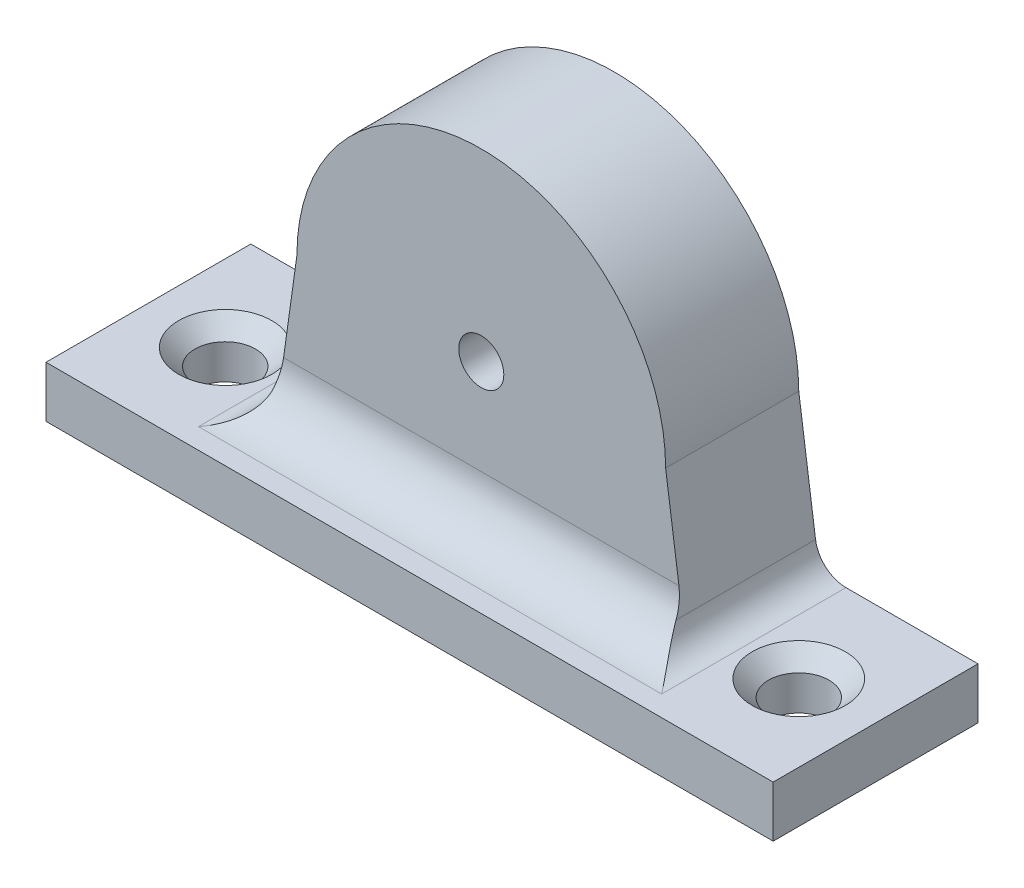
ISO-10303-21;
HEADER;
FILE_DESCRIPTION(('STEP AP214'),'2;1');
FILE_NAME('part.step','',(''),(''),'','','');
FILE_SCHEMA(('AUTOMOTIVE_DESIGN { 1 0 10303 214 1 1 1 1 }'));
ENDSEC;
DATA;
#1=APPLICATION_CONTEXT('core data for automotive mechanical design processes');
#2=APPLICATION_PROTOCOL_DEFINITION('international standard','automotive_design',2000,#1);
#3=PRODUCT_CONTEXT('',#1,'mechanical');
#4=PRODUCT('Part','Part','',(#3));
#5=PRODUCT_RELATED_PRODUCT_CATEGORY('part','',(#4));
#6=PRODUCT_DEFINITION_FORMATION('','',#4);
#7=PRODUCT_DEFINITION_CONTEXT('part definition',#1,'design');
#8=PRODUCT_DEFINITION('design','',#6,#7);
#9=PRODUCT_DEFINITION_SHAPE('','',#8);
#10=(LENGTH_UNIT() NAMED_UNIT(*) SI_UNIT(.MILLI.,.METRE.));
#11=(NAMED_UNIT(*) PLANE_ANGLE_UNIT() SI_UNIT($,.RADIAN.));
#12=(NAMED_UNIT(*) SI_UNIT($,.STERADIAN.) SOLID_ANGLE_UNIT());
#13=UNCERTAINTY_MEASURE_WITH_UNIT(LENGTH_MEASURE(1.E-05),#10,'distance_accuracy_value','');
#14=(GEOMETRIC_REPRESENTATION_CONTEXT(3) GLOBAL_UNCERTAINTY_ASSIGNED_CONTEXT((#13)) GLOBAL_UNIT_ASSIGNED_CONTEXT((#10,
#11,#12)) REPRESENTATION_CONTEXT('',''));
#15=CARTESIAN_POINT('',(0.,0.,0.));
#16=DIRECTION('',(0.,0.,1.));
#17=DIRECTION('',(1.,0.,0.));
#18=AXIS2_PLACEMENT_3D('',#15,#16,#17);
#19=CARTESIAN_POINT('',(18.,19.3,-10.));
#20=DIRECTION('',(-0.990360756265353,-0.138511993883266,0.));
#21=DIRECTION('',(0.,0.,-1.));
#22=AXIS2_PLACEMENT_3D('',#19,#20,#21);
#23=PLANE('',#22);
#24=DIRECTION('',(-0.138511993883266,0.990360756265353,0.));
#25=VECTOR('',#24,1.);
#26=CARTESIAN_POINT('',(17.3093193918174,24.2383663485059,3.));
#27=LINE('',#26,#25);
#28=CARTESIAN_POINT('',(18.,19.3,3.));
#29=VERTEX_POINT('',#28);
#30=CARTESIAN_POINT('',(19.3006993006993,10.,3.));
#31=VERTEX_POINT('',#30);
#32=EDGE_CURVE('E213',#29,#31,#27,.F.);
#33=ORIENTED_EDGE('',*,*,#32,.T.);
#34=CARTESIAN_POINT('',(19.3006993006993,10.,8.));
#35=DIRECTION('',(-0.990360756265353,-0.138511993883266,0.));
#36=DIRECTION('',(0.138511993883266,-0.990360756265353,0.));
#37=AXIS2_PLACEMENT_3D('',#34,#35,#36);
#38=ELLIPSE('',#37,5.04866531551087,5.);
#39=CARTESIAN_POINT('',(19.63853650093,7.5844640183502,3.62219393744365));
#40=VERTEX_POINT('',#39);
#41=EDGE_CURVE('E234',#31,#40,#38,.T.);
#42=ORIENTED_EDGE('',*,*,#41,.T.);
#43=DIRECTION('',(0.,0.,1.));
#44=VECTOR('',#43,1.);
#45=CARTESIAN_POINT('',(19.63853650093,7.5844640183502,-10.));
#46=LINE('',#45,#44);
#47=CARTESIAN_POINT('',(19.63853650093,7.5844640183502,-10.));
#48=VERTEX_POINT('',#47);
#49=EDGE_CURVE('E68',#40,#48,#46,.F.);
#50=ORIENTED_EDGE('',*,*,#49,.T.);
#51=DIRECTION('',(0.138511993883266,-0.990360756265353,0.));
#52=VECTOR('',#51,1.);
#53=CARTESIAN_POINT('',(18.,19.3,-10.));
#54=LINE('',#53,#52);
#55=CARTESIAN_POINT('',(18.,19.3,-10.));
#56=VERTEX_POINT('',#55);
#57=EDGE_CURVE('E216',#48,#56,#54,.F.);
#58=ORIENTED_EDGE('',*,*,#57,.T.);
#59=DIRECTION('',(0.,0.,-1.));
#60=VECTOR('',#59,1.);
#61=CARTESIAN_POINT('',(18.,19.3,-10.));
#62=LINE('',#61,#60);
#63=EDGE_CURVE('E147',#29,#56,#62,.T.);
#64=ORIENTED_EDGE('',*,*,#63,.F.);
#65=EDGE_LOOP('',(#33,#42,#50,#58,#64));
#66=FACE_BOUND('',#65,.T.);
#67=ADVANCED_FACE('F45',(#66),#23,.F.);
#68=CARTESIAN_POINT('',(-18.,19.3,-10.));
#69=DIRECTION('',(0.990360756265353,-0.138511993883266,0.));
#70=DIRECTION('',(0.,0.,1.));
#71=AXIS2_PLACEMENT_3D('',#68,#69,#70);
#72=PLANE('',#71);
#73=DIRECTION('',(0.138511993883266,0.990360756265353,0.));
#74=VECTOR('',#73,1.);
#75=CARTESIAN_POINT('',(-18.,19.3,-10.));
#76=LINE('',#75,#74);
#77=CARTESIAN_POINT('',(-18.,19.3,-10.));
#78=VERTEX_POINT('',#77);
#79=CARTESIAN_POINT('',(-19.63853650093,7.5844640183502,-10.));
#80=VERTEX_POINT('',#79);
#81=EDGE_CURVE('E129',#78,#80,#76,.F.);
#82=ORIENTED_EDGE('',*,*,#81,.T.);
#83=DIRECTION('',(0.,0.,-1.));
#84=VECTOR('',#83,1.);
#85=CARTESIAN_POINT('',(-19.63853650093,7.5844640183502,-10.));
#86=LINE('',#85,#84);
#87=CARTESIAN_POINT('',(-19.63853650093,7.5844640183502,3.62219393744365));
#88=VERTEX_POINT('',#87);
#89=EDGE_CURVE('E60',#80,#88,#86,.F.);
#90=ORIENTED_EDGE('',*,*,#89,.T.);
#91=CARTESIAN_POINT('',(-19.3006993006993,10.,8.));
#92=DIRECTION('',(0.990360756265353,-0.138511993883266,0.));
#93=DIRECTION('',(0.138511993883266,0.990360756265353,0.));
#94=AXIS2_PLACEMENT_3D('',#91,#92,#93);
#95=ELLIPSE('',#94,5.04866531551087,5.);
#96=CARTESIAN_POINT('',(-19.3006993006993,10.,3.));
#97=VERTEX_POINT('',#96);
#98=EDGE_CURVE('E13',#88,#97,#95,.T.);
#99=ORIENTED_EDGE('',*,*,#98,.T.);
#100=DIRECTION('',(-0.138511993883266,-0.990360756265353,0.));
#101=VECTOR('',#100,1.);
#102=CARTESIAN_POINT('',(-18.,19.3,3.));
#103=LINE('',#102,#101);
#104=CARTESIAN_POINT('',(-18.,19.3,3.));
#105=VERTEX_POINT('',#104);
#106=EDGE_CURVE('E137',#97,#105,#103,.F.);
#107=ORIENTED_EDGE('',*,*,#106,.T.);
#108=DIRECTION('',(0.,0.,1.));
#109=VECTOR('',#108,1.);
#110=CARTESIAN_POINT('',(-18.,19.3,-10.));
#111=LINE('',#110,#109);
#112=EDGE_CURVE('E141',#78,#105,#111,.T.);
#113=ORIENTED_EDGE('',*,*,#112,.F.);
#114=EDGE_LOOP('',(#82,#90,#99,#107,#113));
#115=FACE_BOUND('',#114,.T.);
#116=ADVANCED_FACE('F142',(#115),#72,.F.);
#117=CARTESIAN_POINT('',(-35.5,5.,10.));
#118=DIRECTION('',(0.,0.,-1.));
#119=DIRECTION('',(-1.,0.,0.));
#120=AXIS2_PLACEMENT_3D('',#117,#118,#119);
#121=PLANE('',#120);
#122=DIRECTION('',(1.,0.,0.));
#123=VECTOR('',#122,1.);
#124=CARTESIAN_POINT('',(-35.5,0.,10.));
#125=LINE('',#124,#123);
#126=CARTESIAN_POINT('',(-35.5,0.,10.));
#127=VERTEX_POINT('',#126);
#128=CARTESIAN_POINT('',(35.5,0.,10.));
#129=VERTEX_POINT('',#128);
#130=EDGE_CURVE('E166',#127,#129,#125,.T.);
#131=ORIENTED_EDGE('',*,*,#130,.T.);
#132=DIRECTION('',(0.,-1.,0.));
#133=VECTOR('',#132,1.);
#134=CARTESIAN_POINT('',(35.5,5.,10.));
#135=LINE('',#134,#133);
#136=CARTESIAN_POINT('',(35.5,5.,10.));
#137=VERTEX_POINT('',#136);
#138=EDGE_CURVE('E198',#137,#129,#135,.T.);
#139=ORIENTED_EDGE('',*,*,#138,.F.);
#140=DIRECTION('',(1.,0.,0.));
#141=VECTOR('',#140,1.);
#142=CARTESIAN_POINT('',(-35.5,5.,10.));
#143=LINE('',#142,#141);
#144=CARTESIAN_POINT('',(-35.5,5.,10.));
#145=VERTEX_POINT('',#144);
#146=EDGE_CURVE('E169',#145,#137,#143,.T.);
#147=ORIENTED_EDGE('',*,*,#146,.F.);
#148=DIRECTION('',(0.,-1.,0.));
#149=VECTOR('',#148,1.);
#150=CARTESIAN_POINT('',(-35.5,5.,10.));
#151=LINE('',#150,#149);
#152=EDGE_CURVE('E182',#145,#127,#151,.T.);
#153=ORIENTED_EDGE('',*,*,#152,.T.);
#154=EDGE_LOOP('',(#131,#139,#147,#153));
#155=FACE_BOUND('',#154,.T.);
#156=ADVANCED_FACE('F267',(#155),#121,.F.);
#157=CARTESIAN_POINT('',(35.5,5.,10.));
#158=DIRECTION('',(-1.,0.,0.));
#159=DIRECTION('',(0.,0.,1.));
#160=AXIS2_PLACEMENT_3D('',#157,#158,#159);
#161=PLANE('',#160);
#162=DIRECTION('',(0.,0.,-1.));
#163=VECTOR('',#162,1.);
#164=CARTESIAN_POINT('',(35.5,0.,10.));
#165=LINE('',#164,#163);
#166=CARTESIAN_POINT('',(35.5,0.,-10.));
#167=VERTEX_POINT('',#166);
#168=EDGE_CURVE('E185',#129,#167,#165,.T.);
#169=ORIENTED_EDGE('',*,*,#168,.T.);
#170=DIRECTION('',(0.,-1.,0.));
#171=VECTOR('',#170,1.);
#172=CARTESIAN_POINT('',(35.5,5.,-10.));
#173=LINE('',#172,#171);
#174=CARTESIAN_POINT('',(35.5,5.,-10.));
#175=VERTEX_POINT('',#174);
#176=EDGE_CURVE('E196',#175,#167,#173,.T.);
#177=ORIENTED_EDGE('',*,*,#176,.F.);
#178=DIRECTION('',(0.,0.,-1.));
#179=VECTOR('',#178,1.);
#180=CARTESIAN_POINT('',(35.5,5.,10.));
#181=LINE('',#180,#179);
#182=EDGE_CURVE('E172',#137,#175,#181,.T.);
#183=ORIENTED_EDGE('',*,*,#182,.F.);
#184=ORIENTED_EDGE('',*,*,#138,.T.);
#185=EDGE_LOOP('',(#169,#177,#183,#184));
#186=FACE_BOUND('',#185,.T.);
#187=ADVANCED_FACE('F283',(#186),#161,.F.);
#188=CARTESIAN_POINT('',(-35.5,5.,-10.));
#189=DIRECTION('',(0.,0.,-1.));
#190=DIRECTION('',(-1.,0.,0.));
#191=AXIS2_PLACEMENT_3D('',#188,#189,#190);
#192=PLANE('',#191);
#193=ORIENTED_EDGE('',*,*,#57,.F.);
#194=CARTESIAN_POINT('',(22.6096187697261,8.,-10.));
#195=DIRECTION('',(0.,0.,-1.));
#196=DIRECTION('',(-1.,0.,0.));
#197=AXIS2_PLACEMENT_3D('',#194,#195,#196);
#198=CIRCLE('',#197,3.);
#199=CARTESIAN_POINT('',(22.6096187697261,5.,-10.));
#200=VERTEX_POINT('',#199);
#201=EDGE_CURVE('E225',#48,#200,#198,.F.);
#202=ORIENTED_EDGE('',*,*,#201,.T.);
#203=DIRECTION('',(1.,0.,0.));
#204=VECTOR('',#203,1.);
#205=CARTESIAN_POINT('',(-35.5,5.,-10.));
#206=LINE('',#205,#204);
#207=EDGE_CURVE('E176',#200,#175,#206,.T.);
#208=ORIENTED_EDGE('',*,*,#207,.T.);
#209=ORIENTED_EDGE('',*,*,#176,.T.);
#210=DIRECTION('',(1.,0.,0.));
#211=VECTOR('',#210,1.);
#212=CARTESIAN_POINT('',(-35.5,0.,-10.));
#213=LINE('',#212,#211);
#214=CARTESIAN_POINT('',(-35.5,0.,-10.));
#215=VERTEX_POINT('',#214);
#216=EDGE_CURVE('E188',#215,#167,#213,.T.);
#217=ORIENTED_EDGE('',*,*,#216,.F.);
#218=DIRECTION('',(0.,-1.,0.));
#219=VECTOR('',#218,1.);
#220=CARTESIAN_POINT('',(-35.5,5.,-10.));
#221=LINE('',#220,#219);
#222=CARTESIAN_POINT('',(-35.5,5.,-10.));
#223=VERTEX_POINT('',#222);
#224=EDGE_CURVE('E194',#223,#215,#221,.T.);
#225=ORIENTED_EDGE('',*,*,#224,.F.);
#226=CARTESIAN_POINT('',(-22.6096187697261,5.,-10.));
#227=VERTEX_POINT('',#226);
#228=EDGE_CURVE('E177',#223,#227,#206,.T.);
#229=ORIENTED_EDGE('',*,*,#228,.T.);
#230=CARTESIAN_POINT('',(-22.6096187697261,8.,-10.));
#231=DIRECTION('',(0.,0.,-1.));
#232=DIRECTION('',(-1.,0.,0.));
#233=AXIS2_PLACEMENT_3D('',#230,#231,#232);
#234=CIRCLE('',#233,3.);
#235=EDGE_CURVE('E136',#227,#80,#234,.F.);
#236=ORIENTED_EDGE('',*,*,#235,.T.);
#237=ORIENTED_EDGE('',*,*,#81,.F.);
#238=CARTESIAN_POINT('',(0.,19.3,-10.));
#239=DIRECTION('',(0.,0.,-1.));
#240=DIRECTION('',(1.,0.,0.));
#241=AXIS2_PLACEMENT_3D('',#238,#239,#240);
#242=CIRCLE('',#241,18.);
#243=EDGE_CURVE('E134',#78,#56,#242,.T.);
#244=ORIENTED_EDGE('',*,*,#243,.T.);
#245=EDGE_LOOP('',(#193,#202,#208,#209,#217,#225,#229,#236,#237,#244));
#246=FACE_BOUND('',#245,.T.);
#247=ADVANCED_FACE('F132',(#246),#192,.T.);
#248=CARTESIAN_POINT('',(-35.5,5.,10.));
#249=DIRECTION('',(-1.,0.,0.));
#250=DIRECTION('',(0.,0.,1.));
#251=AXIS2_PLACEMENT_3D('',#248,#249,#250);
#252=PLANE('',#251);
#253=DIRECTION('',(0.,0.,-1.));
#254=VECTOR('',#253,1.);
#255=CARTESIAN_POINT('',(-35.5,0.,10.));
#256=LINE('',#255,#254);
#257=EDGE_CURVE('E173',#127,#215,#256,.T.);
#258=ORIENTED_EDGE('',*,*,#257,.F.);
#259=ORIENTED_EDGE('',*,*,#152,.F.);
#260=DIRECTION('',(0.,0.,-1.));
#261=VECTOR('',#260,1.);
#262=CARTESIAN_POINT('',(-35.5,5.,10.));
#263=LINE('',#262,#261);
#264=EDGE_CURVE('E179',#145,#223,#263,.T.);
#265=ORIENTED_EDGE('',*,*,#264,.T.);
#266=ORIENTED_EDGE('',*,*,#224,.T.);
#267=EDGE_LOOP('',(#258,#259,#265,#266));
#268=FACE_BOUND('',#267,.T.);
#269=ADVANCED_FACE('F290',(#268),#252,.T.);
#270=CARTESIAN_POINT('',(0.,5.,0.));
#271=DIRECTION('',(0.,1.,0.));
#272=DIRECTION('',(0.,0.,1.));
#273=AXIS2_PLACEMENT_3D('',#270,#271,#272);
#274=PLANE('',#273);
#275=DIRECTION('',(0.,0.,1.));
#276=VECTOR('',#275,1.);
#277=CARTESIAN_POINT('',(22.6096187697261,5.,0.));
#278=LINE('',#277,#276);
#279=CARTESIAN_POINT('',(22.6096187697261,5.,8.));
#280=VERTEX_POINT('',#279);
#281=EDGE_CURVE('E221',#200,#280,#278,.T.);
#282=ORIENTED_EDGE('',*,*,#281,.T.);
#283=DIRECTION('',(1.,0.,0.));
#284=VECTOR('',#283,1.);
#285=CARTESIAN_POINT('',(0.,5.,8.));
#286=LINE('',#285,#284);
#287=CARTESIAN_POINT('',(-22.6096187697261,5.,8.));
#288=VERTEX_POINT('',#287);
#289=EDGE_CURVE('E231',#280,#288,#286,.F.);
#290=ORIENTED_EDGE('',*,*,#289,.T.);
#291=DIRECTION('',(0.,0.,-1.));
#292=VECTOR('',#291,1.);
#293=CARTESIAN_POINT('',(-22.6096187697261,5.,0.));
#294=LINE('',#293,#292);
#295=EDGE_CURVE('E218',#288,#227,#294,.T.);
#296=ORIENTED_EDGE('',*,*,#295,.T.);
#297=ORIENTED_EDGE('',*,*,#228,.F.);
#298=ORIENTED_EDGE('',*,*,#264,.F.);
#299=ORIENTED_EDGE('',*,*,#146,.T.);
#300=ORIENTED_EDGE('',*,*,#182,.T.);
#301=ORIENTED_EDGE('',*,*,#207,.F.);
#302=EDGE_LOOP('',(#282,#290,#296,#297,#298,#299,#300,#301));
#303=FACE_BOUND('',#302,.T.);
#304=CARTESIAN_POINT('',(28.,5.,0.));
#305=DIRECTION('',(0.,1.,0.));
#306=DIRECTION('',(0.,0.,1.));
#307=AXIS2_PLACEMENT_3D('',#304,#305,#306);
#308=CIRCLE('',#307,4.55000000000001);
#309=CARTESIAN_POINT('',(28.,5.,4.55000000000001));
#310=VERTEX_POINT('',#309);
#311=EDGE_CURVE('E207',#310,#310,#308,.F.);
#312=ORIENTED_EDGE('',*,*,#311,.T.);
#313=EDGE_LOOP('',(#312));
#314=FACE_BOUND('',#313,.T.);
#315=CARTESIAN_POINT('',(-28.,5.,0.));
#316=DIRECTION('',(0.,1.,0.));
#317=DIRECTION('',(0.,0.,1.));
#318=AXIS2_PLACEMENT_3D('',#315,#316,#317);
#319=CIRCLE('',#318,4.54999999999998);
#320=CARTESIAN_POINT('',(-28.,5.,4.54999999999998));
#321=VERTEX_POINT('',#320);
#322=EDGE_CURVE('E204',#321,#321,#319,.F.);
#323=ORIENTED_EDGE('',*,*,#322,.T.);
#324=EDGE_LOOP('',(#323));
#325=FACE_BOUND('',#324,.T.);
#326=ADVANCED_FACE('F278',(#303,#314,#325),#274,.T.);
#327=CARTESIAN_POINT('',(0.,0.,0.));
#328=DIRECTION('',(0.,1.,0.));
#329=DIRECTION('',(0.,0.,1.));
#330=AXIS2_PLACEMENT_3D('',#327,#328,#329);
#331=PLANE('',#330);
#332=CARTESIAN_POINT('',(28.,0.,0.));
#333=DIRECTION('',(0.,1.,0.));
#334=DIRECTION('',(0.,0.,1.));
#335=AXIS2_PLACEMENT_3D('',#332,#333,#334);
#336=CIRCLE('',#335,2.95);
#337=CARTESIAN_POINT('',(28.,0.,2.95));
#338=VERTEX_POINT('',#337);
#339=EDGE_CURVE('E163',#338,#338,#336,.T.);
#340=ORIENTED_EDGE('',*,*,#339,.T.);
#341=EDGE_LOOP('',(#340));
#342=FACE_BOUND('',#341,.T.);
#343=CARTESIAN_POINT('',(-28.,0.,0.));
#344=DIRECTION('',(0.,1.,0.));
#345=DIRECTION('',(0.,0.,1.));
#346=AXIS2_PLACEMENT_3D('',#343,#344,#345);
#347=CIRCLE('',#346,2.95);
#348=CARTESIAN_POINT('',(-28.,0.,2.95));
#349=VERTEX_POINT('',#348);
#350=EDGE_CURVE('E162',#349,#349,#347,.T.);
#351=ORIENTED_EDGE('',*,*,#350,.T.);
#352=EDGE_LOOP('',(#351));
#353=FACE_BOUND('',#352,.T.);
#354=ORIENTED_EDGE('',*,*,#130,.F.);
#355=ORIENTED_EDGE('',*,*,#257,.T.);
#356=ORIENTED_EDGE('',*,*,#216,.T.);
#357=ORIENTED_EDGE('',*,*,#168,.F.);
#358=EDGE_LOOP('',(#354,#355,#356,#357));
#359=FACE_BOUND('',#358,.T.);
#360=ADVANCED_FACE('F287',(#342,#353,#359),#331,.F.);
#361=CARTESIAN_POINT('',(-28.,0.,0.));
#362=DIRECTION('',(0.,1.,0.));
#363=DIRECTION('',(0.,0.,1.));
#364=AXIS2_PLACEMENT_3D('',#361,#362,#363);
#365=CYLINDRICAL_SURFACE('',#364,2.95);
#366=CARTESIAN_POINT('',(-28.,3.40000000000002,0.));
#367=DIRECTION('',(0.,1.,0.));
#368=DIRECTION('',(0.,0.,1.));
#369=AXIS2_PLACEMENT_3D('',#366,#367,#368);
#370=CIRCLE('',#369,2.95);
#371=CARTESIAN_POINT('',(-28.,3.40000000000002,2.95));
#372=VERTEX_POINT('',#371);
#373=EDGE_CURVE('E138',#372,#372,#370,.T.);
#374=ORIENTED_EDGE('',*,*,#373,.T.);
#375=EDGE_LOOP('',(#374));
#376=FACE_BOUND('',#375,.T.);
#377=ORIENTED_EDGE('',*,*,#350,.F.);
#378=EDGE_LOOP('',(#377));
#379=FACE_BOUND('',#378,.T.);
#380=ADVANCED_FACE('F331',(#376,#379),#365,.F.);
#381=CARTESIAN_POINT('',(28.,0.,0.));
#382=DIRECTION('',(0.,1.,0.));
#383=DIRECTION('',(0.,0.,1.));
#384=AXIS2_PLACEMENT_3D('',#381,#382,#383);
#385=CYLINDRICAL_SURFACE('',#384,2.95);
#386=CARTESIAN_POINT('',(28.,3.4,0.));
#387=DIRECTION('',(0.,1.,0.));
#388=DIRECTION('',(0.,0.,1.));
#389=AXIS2_PLACEMENT_3D('',#386,#387,#388);
#390=CIRCLE('',#389,2.95);
#391=CARTESIAN_POINT('',(28.,3.4,2.95));
#392=VERTEX_POINT('',#391);
#393=EDGE_CURVE('E201',#392,#392,#390,.T.);
#394=ORIENTED_EDGE('',*,*,#393,.T.);
#395=EDGE_LOOP('',(#394));
#396=FACE_BOUND('',#395,.T.);
#397=ORIENTED_EDGE('',*,*,#339,.F.);
#398=EDGE_LOOP('',(#397));
#399=FACE_BOUND('',#398,.T.);
#400=ADVANCED_FACE('F311',(#396,#399),#385,.F.);
#401=CARTESIAN_POINT('',(28.,3.4,0.));
#402=DIRECTION('',(0.,1.,0.));
#403=DIRECTION('',(0.,0.,1.));
#404=AXIS2_PLACEMENT_3D('',#401,#402,#403);
#405=CONICAL_SURFACE('',#404,2.95,0.78539816339745);
#406=ORIENTED_EDGE('',*,*,#311,.F.);
#407=EDGE_LOOP('',(#406));
#408=FACE_BOUND('',#407,.T.);
#409=ORIENTED_EDGE('',*,*,#393,.F.);
#410=EDGE_LOOP('',(#409));
#411=FACE_BOUND('',#410,.T.);
#412=ADVANCED_FACE('F304',(#408,#411),#405,.F.);
#413=CARTESIAN_POINT('',(-28.,3.40000000000002,0.));
#414=DIRECTION('',(0.,1.,0.));
#415=DIRECTION('',(0.,0.,1.));
#416=AXIS2_PLACEMENT_3D('',#413,#414,#415);
#417=CONICAL_SURFACE('',#416,2.95,0.78539816339745);
#418=ORIENTED_EDGE('',*,*,#322,.F.);
#419=EDGE_LOOP('',(#418));
#420=FACE_BOUND('',#419,.T.);
#421=ORIENTED_EDGE('',*,*,#373,.F.);
#422=EDGE_LOOP('',(#421));
#423=FACE_BOUND('',#422,.T.);
#424=ADVANCED_FACE('F310',(#420,#423),#417,.F.);
#425=CARTESIAN_POINT('',(-18.,19.3,3.));
#426=DIRECTION('',(0.,0.,-1.));
#427=DIRECTION('',(-1.,0.,0.));
#428=AXIS2_PLACEMENT_3D('',#425,#426,#427);
#429=PLANE('',#428);
#430=CARTESIAN_POINT('',(0.,19.3,3.));
#431=DIRECTION('',(0.,0.,1.));
#432=DIRECTION('',(1.,0.,0.));
#433=AXIS2_PLACEMENT_3D('',#430,#431,#432);
#434=CIRCLE('',#433,2.2);
#435=CARTESIAN_POINT('',(2.2,19.3,3.));
#436=VERTEX_POINT('',#435);
#437=EDGE_CURVE('E157',#436,#436,#434,.T.);
#438=ORIENTED_EDGE('',*,*,#437,.F.);
#439=EDGE_LOOP('',(#438));
#440=FACE_BOUND('',#439,.T.);
#441=ORIENTED_EDGE('',*,*,#106,.F.);
#442=DIRECTION('',(1.,0.,0.));
#443=VECTOR('',#442,1.);
#444=CARTESIAN_POINT('',(-18.,10.,3.));
#445=LINE('',#444,#443);
#446=EDGE_CURVE('E228',#97,#31,#445,.T.);
#447=ORIENTED_EDGE('',*,*,#446,.T.);
#448=ORIENTED_EDGE('',*,*,#32,.F.);
#449=CARTESIAN_POINT('',(0.,19.3,3.));
#450=DIRECTION('',(0.,0.,-1.));
#451=DIRECTION('',(1.,0.,0.));
#452=AXIS2_PLACEMENT_3D('',#449,#450,#451);
#453=CIRCLE('',#452,18.);
#454=EDGE_CURVE('E148',#105,#29,#453,.T.);
#455=ORIENTED_EDGE('',*,*,#454,.F.);
#456=EDGE_LOOP('',(#441,#447,#448,#455));
#457=FACE_BOUND('',#456,.T.);
#458=ADVANCED_FACE('F270',(#440,#457),#429,.F.);
#459=CARTESIAN_POINT('',(0.,19.3,3.));
#460=DIRECTION('',(0.,0.,-1.));
#461=DIRECTION('',(-1.,0.,0.));
#462=AXIS2_PLACEMENT_3D('',#459,#460,#461);
#463=CYLINDRICAL_SURFACE('',#462,18.);
#464=ORIENTED_EDGE('',*,*,#243,.F.);
#465=ORIENTED_EDGE('',*,*,#112,.T.);
#466=ORIENTED_EDGE('',*,*,#454,.T.);
#467=ORIENTED_EDGE('',*,*,#63,.T.);
#468=EDGE_LOOP('',(#464,#465,#466,#467));
#469=FACE_BOUND('',#468,.T.);
#470=ADVANCED_FACE('F151',(#469),#463,.T.);
#471=CARTESIAN_POINT('',(0.,19.3,-9.));
#472=DIRECTION('',(0.,0.,1.));
#473=DIRECTION('',(1.,0.,0.));
#474=AXIS2_PLACEMENT_3D('',#471,#472,#473);
#475=CYLINDRICAL_SURFACE('',#474,2.2);
#476=CARTESIAN_POINT('',(0.,19.3,-9.));
#477=DIRECTION('',(0.,0.,1.));
#478=DIRECTION('',(1.,0.,0.));
#479=AXIS2_PLACEMENT_3D('',#476,#477,#478);
#480=CIRCLE('',#479,2.2);
#481=CARTESIAN_POINT('',(2.2,19.3,-9.));
#482=VERTEX_POINT('',#481);
#483=EDGE_CURVE('E153',#482,#482,#480,.T.);
#484=ORIENTED_EDGE('',*,*,#483,.F.);
#485=EDGE_LOOP('',(#484));
#486=FACE_BOUND('',#485,.T.);
#487=ORIENTED_EDGE('',*,*,#437,.T.);
#488=EDGE_LOOP('',(#487));
#489=FACE_BOUND('',#488,.T.);
#490=ADVANCED_FACE('F358',(#486,#489),#475,.F.);
#491=CARTESIAN_POINT('',(0.,19.3,-9.));
#492=DIRECTION('',(0.,0.,1.));
#493=DIRECTION('',(1.,0.,0.));
#494=AXIS2_PLACEMENT_3D('',#491,#492,#493);
#495=PLANE('',#494);
#496=ORIENTED_EDGE('',*,*,#483,.T.);
#497=EDGE_LOOP('',(#496));
#498=FACE_BOUND('',#497,.T.);
#499=ADVANCED_FACE('F251',(#498),#495,.T.);
#500=CARTESIAN_POINT('',(22.6096187697261,8.,0.));
#501=DIRECTION('',(0.,0.,1.));
#502=DIRECTION('',(1.,0.,0.));
#503=AXIS2_PLACEMENT_3D('',#500,#501,#502);
#504=CYLINDRICAL_SURFACE('',#503,3.);
#505=ORIENTED_EDGE('',*,*,#201,.F.);
#506=ORIENTED_EDGE('',*,*,#49,.F.);
#507=CARTESIAN_POINT('',(19.63853650093,7.5844640183502,3.62219393744365));
#508=CARTESIAN_POINT('',(19.6516758111666,7.49051498650996,3.67401136505807));
#509=CARTESIAN_POINT('',(19.6690473429782,7.39878081510673,3.72859107094716));
#510=CARTESIAN_POINT('',(19.711252884602,7.22034586825496,3.84251798344618));
#511=CARTESIAN_POINT('',(19.7360731557372,7.1336361738169,3.90185626679708));
#512=CARTESIAN_POINT('',(19.7919418379846,6.9663673355544,4.02410867171887));
#513=CARTESIAN_POINT('',(19.8229238450006,6.88575428580177,4.0869799366073));
#514=CARTESIAN_POINT('',(19.8904405556834,6.72984621249943,4.21630368523532));
#515=CARTESIAN_POINT('',(19.9269785566882,6.65455438608417,4.28275828037221));
#516=CARTESIAN_POINT('',(20.0171680279644,6.48640793712458,4.44025112263436));
#517=CARTESIAN_POINT('',(20.0725751168669,6.3955403454138,4.53241115356753));
#518=CARTESIAN_POINT('',(20.1901621834393,6.223172121695,4.72099012099338));
#519=CARTESIAN_POINT('',(20.2523432990811,6.14167306825301,4.8174097714393));
#520=CARTESIAN_POINT('',(20.4478709102071,5.91006138482799,5.11291720067182));
#521=CARTESIAN_POINT('',(20.5896895447706,5.77374025684661,5.31738619517603));
#522=CARTESIAN_POINT('',(20.8415324679503,5.57282717795078,5.67026651586142));
#523=CARTESIAN_POINT('',(20.9477827125631,5.49909998905815,5.81640433344452));
#524=CARTESIAN_POINT('',(21.1655491783222,5.36734859940914,6.11195734801102));
#525=CARTESIAN_POINT('',(21.2770677253793,5.30933141203368,6.26137397667506));
#526=CARTESIAN_POINT('',(21.5036073240907,5.20856926285163,6.56218266234524));
#527=CARTESIAN_POINT('',(21.6186219233378,5.16579782395809,6.71357081663567));
#528=CARTESIAN_POINT('',(21.8510885285004,5.09493785236139,7.01778852308041));
#529=CARTESIAN_POINT('',(21.9685393499369,5.06684235055439,7.17061735594026));
#530=CARTESIAN_POINT('',(22.1719439122111,5.03083564064062,7.43443725244717));
#531=CARTESIAN_POINT('',(22.2575649582214,5.01948294231306,7.54523291775342));
#532=CARTESIAN_POINT('',(22.4291141765131,5.00419866303723,7.76696529176576));
#533=CARTESIAN_POINT('',(22.5150420081173,5.00026049410995,7.8779017875394));
#534=CARTESIAN_POINT('',(22.6038452838565,5.00000416750099,7.99254646170429));
#535=CARTESIAN_POINT('',(22.6067320370262,5.00000000095933,7.99627324398704));
#536=CARTESIAN_POINT('',(22.6096187697261,5.,8.));
#537=B_SPLINE_CURVE_WITH_KNOTS('',3,(#507,#508,#509,#510,#511,#512,#513,#514,#515,#516,#517,
#518,#519,#520,#521,#522,#523,#524,#525,#526,#527,#528,#529,#530,#531,#532,#533,#534,#535,#536),
.UNSPECIFIED.,.F.,.F.,(4,2,2,2,2,2,2,2,2,2,2,2,2,2,4),(0.,0.324014065951598,0.647434145733564,
0.967541186908921,1.28783895014233,1.70954823647149,2.13132847551312,2.97890473267685,
3.56370939361495,4.14877469877583,4.73281892066649,5.31658554709527,5.737861291013,
6.1587625448185,6.17290468596665),.UNSPECIFIED.);
#538=EDGE_CURVE('E236',#40,#280,#537,.T.);
#539=ORIENTED_EDGE('',*,*,#538,.T.);
#540=ORIENTED_EDGE('',*,*,#281,.F.);
#541=EDGE_LOOP('',(#505,#506,#539,#540));
#542=FACE_BOUND('',#541,.T.);
#543=ADVANCED_FACE('F246',(#542),#504,.F.);
#544=CARTESIAN_POINT('',(-22.6096187697261,8.,0.));
#545=DIRECTION('',(0.,0.,-1.));
#546=DIRECTION('',(-1.,0.,0.));
#547=AXIS2_PLACEMENT_3D('',#544,#545,#546);
#548=CYLINDRICAL_SURFACE('',#547,3.);
#549=ORIENTED_EDGE('',*,*,#295,.F.);
#550=CARTESIAN_POINT('',(-19.63853650093,7.5844640183502,3.62219393744365));
#551=CARTESIAN_POINT('',(-19.6516758111666,7.49051498650996,3.67401136505807));
#552=CARTESIAN_POINT('',(-19.6690473429782,7.39878081510673,3.72859107094716));
#553=CARTESIAN_POINT('',(-19.711252884602,7.22034586825496,3.84251798344618));
#554=CARTESIAN_POINT('',(-19.7360731557372,7.1336361738169,3.90185626679708));
#555=CARTESIAN_POINT('',(-19.7919418379846,6.9663673355544,4.02410867171887));
#556=CARTESIAN_POINT('',(-19.8229238450006,6.88575428580178,4.0869799366073));
#557=CARTESIAN_POINT('',(-19.8904405556834,6.72984621249944,4.21630368523531));
#558=CARTESIAN_POINT('',(-19.9269785566882,6.65455438608417,4.2827582803722));
#559=CARTESIAN_POINT('',(-20.0171680279644,6.48640793712458,4.44025112263436));
#560=CARTESIAN_POINT('',(-20.0725751168669,6.39554034541381,4.53241115356753));
#561=CARTESIAN_POINT('',(-20.1901621834393,6.223172121695,4.72099012099338));
#562=CARTESIAN_POINT('',(-20.2523432990811,6.14167306825301,4.8174097714393));
#563=CARTESIAN_POINT('',(-20.4478709102071,5.91006138482799,5.11291720067181));
#564=CARTESIAN_POINT('',(-20.5896895447706,5.77374025684662,5.31738619517603));
#565=CARTESIAN_POINT('',(-20.8415324679503,5.57282717795078,5.67026651586141));
#566=CARTESIAN_POINT('',(-20.9477827125631,5.49909998905816,5.81640433344452));
#567=CARTESIAN_POINT('',(-21.1655491783222,5.36734859940914,6.11195734801102));
#568=CARTESIAN_POINT('',(-21.2770677253793,5.30933141203368,6.26137397667505));
#569=CARTESIAN_POINT('',(-21.5036073240907,5.20856926285163,6.56218266234524));
#570=CARTESIAN_POINT('',(-21.6186219233378,5.16579782395809,6.71357081663567));
#571=CARTESIAN_POINT('',(-21.8510885285004,5.09493785236139,7.01778852308041));
#572=CARTESIAN_POINT('',(-21.9685393499369,5.06684235055439,7.17061735594024));
#573=CARTESIAN_POINT('',(-22.1719439122111,5.03083564064062,7.43443725244719));
#574=CARTESIAN_POINT('',(-22.2575649582214,5.01948294231306,7.54523291775346));
#575=CARTESIAN_POINT('',(-22.4291141765131,5.00419866303723,7.76696529176571));
#576=CARTESIAN_POINT('',(-22.5150420081175,5.00026049410995,7.87790178753924));
#577=CARTESIAN_POINT('',(-22.6038452838565,5.00000416750099,7.99254646170428));
#578=CARTESIAN_POINT('',(-22.6067320370262,5.00000000095933,7.99627324398704));
#579=CARTESIAN_POINT('',(-22.6096187697261,5.,8.));
#580=B_SPLINE_CURVE_WITH_KNOTS('',3,(#550,#551,#552,#553,#554,#555,#556,#557,#558,#559,#560,
#561,#562,#563,#564,#565,#566,#567,#568,#569,#570,#571,#572,#573,#574,#575,#576,#577,#578,#579),
.UNSPECIFIED.,.F.,.F.,(4,2,2,2,2,2,2,2,2,2,2,2,2,2,4),(0.,0.324014065951599,0.647434145733567,
0.967541186908919,1.28783895014233,1.70954823647148,2.13132847551312,2.97890473267684,
3.56370939361494,4.14877469877583,4.73281892066648,5.31658554709526,5.737861291013,
6.1587625448185,6.17290468596665),.UNSPECIFIED.);
#581=EDGE_CURVE('E54',#288,#88,#580,.F.);
#582=ORIENTED_EDGE('',*,*,#581,.T.);
#583=ORIENTED_EDGE('',*,*,#89,.F.);
#584=ORIENTED_EDGE('',*,*,#235,.F.);
#585=EDGE_LOOP('',(#549,#582,#583,#584));
#586=FACE_BOUND('',#585,.T.);
#587=ADVANCED_FACE('F250',(#586),#548,.F.);
#588=CARTESIAN_POINT('',(-18.,10.,8.));
#589=DIRECTION('',(1.,0.,0.));
#590=DIRECTION('',(0.,0.,-1.));
#591=AXIS2_PLACEMENT_3D('',#588,#589,#590);
#592=CYLINDRICAL_SURFACE('',#591,5.);
#593=ORIENTED_EDGE('',*,*,#581,.F.);
#594=ORIENTED_EDGE('',*,*,#289,.F.);
#595=ORIENTED_EDGE('',*,*,#538,.F.);
#596=ORIENTED_EDGE('',*,*,#41,.F.);
#597=ORIENTED_EDGE('',*,*,#446,.F.);
#598=ORIENTED_EDGE('',*,*,#98,.F.);
#599=EDGE_LOOP('',(#593,#594,#595,#596,#597,#598));
#600=FACE_BOUND('',#599,.T.);
#601=ADVANCED_FACE('F47',(#600),#592,.F.);
#602=CLOSED_SHELL('',(#67,#116,#156,#187,#247,#269,#326,#360,#380,#400,#412,#424,#458,#470,#490,
#499,#543,#587,#601));
#603=MANIFOLD_SOLID_BREP('B2',#602);
#604=ADVANCED_BREP_SHAPE_REPRESENTATION('',(#18,#603),#14);
#605=SHAPE_DEFINITION_REPRESENTATION(#9,#604);
ENDSEC;
END-ISO-10303-21;
